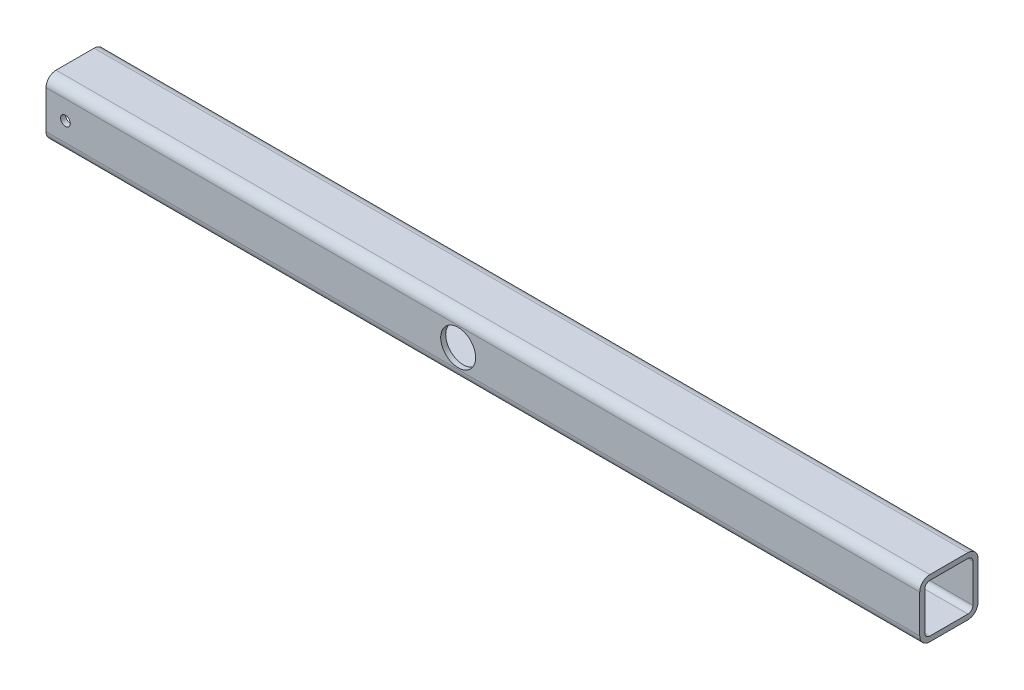
ISO-10303-21;
HEADER;
FILE_DESCRIPTION(('STEP AP214'),'2;1');
FILE_NAME('part.step','',(''),(''),'','','');
FILE_SCHEMA(('AUTOMOTIVE_DESIGN { 1 0 10303 214 1 1 1 1 }'));
ENDSEC;
DATA;
#1=APPLICATION_CONTEXT('core data for automotive mechanical design processes');
#2=APPLICATION_PROTOCOL_DEFINITION('international standard','automotive_design',2000,#1);
#3=PRODUCT_CONTEXT('',#1,'mechanical');
#4=PRODUCT('Part','Part','',(#3));
#5=PRODUCT_RELATED_PRODUCT_CATEGORY('part','',(#4));
#6=PRODUCT_DEFINITION_FORMATION('','',#4);
#7=PRODUCT_DEFINITION_CONTEXT('part definition',#1,'design');
#8=PRODUCT_DEFINITION('design','',#6,#7);
#9=PRODUCT_DEFINITION_SHAPE('','',#8);
#10=(LENGTH_UNIT() NAMED_UNIT(*) SI_UNIT(.MILLI.,.METRE.));
#11=(NAMED_UNIT(*) PLANE_ANGLE_UNIT() SI_UNIT($,.RADIAN.));
#12=(NAMED_UNIT(*) SI_UNIT($,.STERADIAN.) SOLID_ANGLE_UNIT());
#13=UNCERTAINTY_MEASURE_WITH_UNIT(LENGTH_MEASURE(1.E-05),#10,'distance_accuracy_value','');
#14=(GEOMETRIC_REPRESENTATION_CONTEXT(3) GLOBAL_UNCERTAINTY_ASSIGNED_CONTEXT((#13)) GLOBAL_UNIT_ASSIGNED_CONTEXT((#10,
#11,#12)) REPRESENTATION_CONTEXT('',''));
#15=CARTESIAN_POINT('',(0.,0.,0.));
#16=DIRECTION('',(0.,0.,1.));
#17=DIRECTION('',(1.,0.,0.));
#18=AXIS2_PLACEMENT_3D('',#15,#16,#17);
#19=CARTESIAN_POINT('',(225.,9.8,-9.8));
#20=DIRECTION('',(-1.,0.,0.));
#21=DIRECTION('',(0.,0.,1.));
#22=AXIS2_PLACEMENT_3D('',#19,#20,#21);
#23=CYLINDRICAL_SURFACE('',#22,5.2);
#24=CARTESIAN_POINT('',(-225.,9.8,-9.8));
#25=DIRECTION('',(1.,0.,0.));
#26=DIRECTION('',(0.,0.,-1.));
#27=AXIS2_PLACEMENT_3D('',#24,#25,#26);
#28=CIRCLE('',#27,5.2);
#29=CARTESIAN_POINT('',(-225.,9.8,-15.));
#30=VERTEX_POINT('',#29);
#31=CARTESIAN_POINT('',(-225.,15.,-9.8));
#32=VERTEX_POINT('',#31);
#33=EDGE_CURVE('E253',#30,#32,#28,.T.);
#34=ORIENTED_EDGE('',*,*,#33,.T.);
#35=DIRECTION('',(-1.,0.,0.));
#36=VECTOR('',#35,1.);
#37=CARTESIAN_POINT('',(225.,15.,-9.8));
#38=LINE('',#37,#36);
#39=CARTESIAN_POINT('',(225.,15.,-9.8));
#40=VERTEX_POINT('',#39);
#41=EDGE_CURVE('E12',#40,#32,#38,.T.);
#42=ORIENTED_EDGE('',*,*,#41,.F.);
#43=CARTESIAN_POINT('',(225.,9.8,-9.8));
#44=DIRECTION('',(1.,0.,0.));
#45=DIRECTION('',(0.,0.,-1.));
#46=AXIS2_PLACEMENT_3D('',#43,#44,#45);
#47=CIRCLE('',#46,5.2);
#48=CARTESIAN_POINT('',(225.,9.8,-15.));
#49=VERTEX_POINT('',#48);
#50=EDGE_CURVE('E359',#49,#40,#47,.T.);
#51=ORIENTED_EDGE('',*,*,#50,.F.);
#52=DIRECTION('',(-1.,0.,0.));
#53=VECTOR('',#52,1.);
#54=CARTESIAN_POINT('',(225.,9.8,-15.));
#55=LINE('',#54,#53);
#56=EDGE_CURVE('E276',#49,#30,#55,.T.);
#57=ORIENTED_EDGE('',*,*,#56,.T.);
#58=EDGE_LOOP('',(#34,#42,#51,#57));
#59=FACE_BOUND('',#58,.T.);
#60=ADVANCED_FACE('F67',(#59),#23,.T.);
#61=CARTESIAN_POINT('',(225.,15.,-9.8));
#62=DIRECTION('',(0.,-1.,0.));
#63=DIRECTION('',(0.,0.,-1.));
#64=AXIS2_PLACEMENT_3D('',#61,#62,#63);
#65=PLANE('',#64);
#66=DIRECTION('',(0.,0.,1.));
#67=VECTOR('',#66,1.);
#68=CARTESIAN_POINT('',(-225.,15.,-9.8));
#69=LINE('',#68,#67);
#70=CARTESIAN_POINT('',(-225.,15.,9.8));
#71=VERTEX_POINT('',#70);
#72=EDGE_CURVE('E257',#32,#71,#69,.T.);
#73=ORIENTED_EDGE('',*,*,#72,.T.);
#74=DIRECTION('',(-1.,0.,0.));
#75=VECTOR('',#74,1.);
#76=CARTESIAN_POINT('',(225.,15.,9.8));
#77=LINE('',#76,#75);
#78=CARTESIAN_POINT('',(225.,15.,9.8));
#79=VERTEX_POINT('',#78);
#80=EDGE_CURVE('E78',#79,#71,#77,.T.);
#81=ORIENTED_EDGE('',*,*,#80,.F.);
#82=DIRECTION('',(0.,0.,1.));
#83=VECTOR('',#82,1.);
#84=CARTESIAN_POINT('',(225.,15.,-9.8));
#85=LINE('',#84,#83);
#86=EDGE_CURVE('E362',#40,#79,#85,.T.);
#87=ORIENTED_EDGE('',*,*,#86,.F.);
#88=ORIENTED_EDGE('',*,*,#41,.T.);
#89=EDGE_LOOP('',(#73,#81,#87,#88));
#90=FACE_BOUND('',#89,.T.);
#91=ADVANCED_FACE('F404',(#90),#65,.F.);
#92=CARTESIAN_POINT('',(225.,9.8,9.8));
#93=DIRECTION('',(-1.,0.,0.));
#94=DIRECTION('',(0.,0.,1.));
#95=AXIS2_PLACEMENT_3D('',#92,#93,#94);
#96=CYLINDRICAL_SURFACE('',#95,5.2);
#97=CARTESIAN_POINT('',(-225.,9.8,9.8));
#98=DIRECTION('',(1.,0.,0.));
#99=DIRECTION('',(0.,0.,-1.));
#100=AXIS2_PLACEMENT_3D('',#97,#98,#99);
#101=CIRCLE('',#100,5.2);
#102=CARTESIAN_POINT('',(-225.,9.8,15.));
#103=VERTEX_POINT('',#102);
#104=EDGE_CURVE('E260',#71,#103,#101,.T.);
#105=ORIENTED_EDGE('',*,*,#104,.T.);
#106=DIRECTION('',(-1.,0.,0.));
#107=VECTOR('',#106,1.);
#108=CARTESIAN_POINT('',(225.,9.8,15.));
#109=LINE('',#108,#107);
#110=CARTESIAN_POINT('',(225.,9.8,15.));
#111=VERTEX_POINT('',#110);
#112=EDGE_CURVE('E287',#111,#103,#109,.T.);
#113=ORIENTED_EDGE('',*,*,#112,.F.);
#114=CARTESIAN_POINT('',(225.,9.8,9.8));
#115=DIRECTION('',(1.,0.,0.));
#116=DIRECTION('',(0.,0.,-1.));
#117=AXIS2_PLACEMENT_3D('',#114,#115,#116);
#118=CIRCLE('',#117,5.2);
#119=EDGE_CURVE('E365',#79,#111,#118,.T.);
#120=ORIENTED_EDGE('',*,*,#119,.F.);
#121=ORIENTED_EDGE('',*,*,#80,.T.);
#122=EDGE_LOOP('',(#105,#113,#120,#121));
#123=FACE_BOUND('',#122,.T.);
#124=ADVANCED_FACE('F409',(#123),#96,.T.);
#125=CARTESIAN_POINT('',(225.,-9.8,15.));
#126=DIRECTION('',(0.,0.,-1.));
#127=DIRECTION('',(-1.,0.,0.));
#128=AXIS2_PLACEMENT_3D('',#125,#126,#127);
#129=PLANE('',#128);
#130=CARTESIAN_POINT('',(-215.,0.,15.));
#131=DIRECTION('',(0.,0.,1.));
#132=DIRECTION('',(1.,0.,0.));
#133=AXIS2_PLACEMENT_3D('',#130,#131,#132);
#134=CIRCLE('',#133,2.5);
#135=CARTESIAN_POINT('',(-212.5,0.,15.));
#136=VERTEX_POINT('',#135);
#137=EDGE_CURVE('E575',#136,#136,#134,.T.);
#138=ORIENTED_EDGE('',*,*,#137,.F.);
#139=EDGE_LOOP('',(#138));
#140=FACE_BOUND('',#139,.T.);
#141=CARTESIAN_POINT('',(-12.73,0.,15.));
#142=DIRECTION('',(0.,0.,1.));
#143=DIRECTION('',(1.,0.,0.));
#144=AXIS2_PLACEMENT_3D('',#141,#142,#143);
#145=CIRCLE('',#144,9.);
#146=CARTESIAN_POINT('',(-3.72999999999999,0.,15.));
#147=VERTEX_POINT('',#146);
#148=EDGE_CURVE('E585',#147,#147,#145,.T.);
#149=ORIENTED_EDGE('',*,*,#148,.F.);
#150=EDGE_LOOP('',(#149));
#151=FACE_BOUND('',#150,.T.);
#152=DIRECTION('',(0.,-1.,0.));
#153=VECTOR('',#152,1.);
#154=CARTESIAN_POINT('',(-225.,-9.8,15.));
#155=LINE('',#154,#153);
#156=CARTESIAN_POINT('',(-225.,-9.8,15.));
#157=VERTEX_POINT('',#156);
#158=EDGE_CURVE('E263',#103,#157,#155,.T.);
#159=ORIENTED_EDGE('',*,*,#158,.T.);
#160=DIRECTION('',(-1.,0.,0.));
#161=VECTOR('',#160,1.);
#162=CARTESIAN_POINT('',(225.,-9.8,15.));
#163=LINE('',#162,#161);
#164=CARTESIAN_POINT('',(225.,-9.8,15.));
#165=VERTEX_POINT('',#164);
#166=EDGE_CURVE('E283',#165,#157,#163,.T.);
#167=ORIENTED_EDGE('',*,*,#166,.F.);
#168=DIRECTION('',(0.,-1.,0.));
#169=VECTOR('',#168,1.);
#170=CARTESIAN_POINT('',(225.,-9.8,15.));
#171=LINE('',#170,#169);
#172=EDGE_CURVE('E368',#111,#165,#171,.T.);
#173=ORIENTED_EDGE('',*,*,#172,.F.);
#174=ORIENTED_EDGE('',*,*,#112,.T.);
#175=EDGE_LOOP('',(#159,#167,#173,#174));
#176=FACE_BOUND('',#175,.T.);
#177=ADVANCED_FACE('F376',(#140,#151,#176),#129,.F.);
#178=CARTESIAN_POINT('',(225.,-9.8,9.8));
#179=DIRECTION('',(-1.,0.,0.));
#180=DIRECTION('',(0.,0.,1.));
#181=AXIS2_PLACEMENT_3D('',#178,#179,#180);
#182=CYLINDRICAL_SURFACE('',#181,5.2);
#183=CARTESIAN_POINT('',(-225.,-9.8,9.8));
#184=DIRECTION('',(1.,0.,0.));
#185=DIRECTION('',(0.,0.,-1.));
#186=AXIS2_PLACEMENT_3D('',#183,#184,#185);
#187=CIRCLE('',#186,5.2);
#188=CARTESIAN_POINT('',(-225.,-15.,9.8));
#189=VERTEX_POINT('',#188);
#190=EDGE_CURVE('E266',#157,#189,#187,.T.);
#191=ORIENTED_EDGE('',*,*,#190,.T.);
#192=DIRECTION('',(-1.,0.,0.));
#193=VECTOR('',#192,1.);
#194=CARTESIAN_POINT('',(225.,-15.,9.8));
#195=LINE('',#194,#193);
#196=CARTESIAN_POINT('',(225.,-15.,9.8));
#197=VERTEX_POINT('',#196);
#198=EDGE_CURVE('E209',#197,#189,#195,.T.);
#199=ORIENTED_EDGE('',*,*,#198,.F.);
#200=CARTESIAN_POINT('',(225.,-9.8,9.8));
#201=DIRECTION('',(1.,0.,0.));
#202=DIRECTION('',(0.,0.,-1.));
#203=AXIS2_PLACEMENT_3D('',#200,#201,#202);
#204=CIRCLE('',#203,5.2);
#205=EDGE_CURVE('E198',#165,#197,#204,.T.);
#206=ORIENTED_EDGE('',*,*,#205,.F.);
#207=ORIENTED_EDGE('',*,*,#166,.T.);
#208=EDGE_LOOP('',(#191,#199,#206,#207));
#209=FACE_BOUND('',#208,.T.);
#210=ADVANCED_FACE('F380',(#209),#182,.T.);
#211=CARTESIAN_POINT('',(225.,-15.,9.8));
#212=DIRECTION('',(0.,1.,0.));
#213=DIRECTION('',(0.,0.,1.));
#214=AXIS2_PLACEMENT_3D('',#211,#212,#213);
#215=PLANE('',#214);
#216=DIRECTION('',(0.,0.,-1.));
#217=VECTOR('',#216,1.);
#218=CARTESIAN_POINT('',(-225.,-15.,9.8));
#219=LINE('',#218,#217);
#220=CARTESIAN_POINT('',(-225.,-15.,-9.8));
#221=VERTEX_POINT('',#220);
#222=EDGE_CURVE('E207',#189,#221,#219,.T.);
#223=ORIENTED_EDGE('',*,*,#222,.T.);
#224=DIRECTION('',(-1.,0.,0.));
#225=VECTOR('',#224,1.);
#226=CARTESIAN_POINT('',(225.,-15.,-9.8));
#227=LINE('',#226,#225);
#228=CARTESIAN_POINT('',(225.,-15.,-9.8));
#229=VERTEX_POINT('',#228);
#230=EDGE_CURVE('E204',#229,#221,#227,.T.);
#231=ORIENTED_EDGE('',*,*,#230,.F.);
#232=DIRECTION('',(0.,0.,-1.));
#233=VECTOR('',#232,1.);
#234=CARTESIAN_POINT('',(225.,-15.,9.8));
#235=LINE('',#234,#233);
#236=EDGE_CURVE('E192',#197,#229,#235,.T.);
#237=ORIENTED_EDGE('',*,*,#236,.F.);
#238=ORIENTED_EDGE('',*,*,#198,.T.);
#239=EDGE_LOOP('',(#223,#231,#237,#238));
#240=FACE_BOUND('',#239,.T.);
#241=ADVANCED_FACE('F205',(#240),#215,.F.);
#242=CARTESIAN_POINT('',(225.,-9.8,-9.8));
#243=DIRECTION('',(-1.,0.,0.));
#244=DIRECTION('',(0.,0.,1.));
#245=AXIS2_PLACEMENT_3D('',#242,#243,#244);
#246=CYLINDRICAL_SURFACE('',#245,5.2);
#247=CARTESIAN_POINT('',(-225.,-9.8,-9.8));
#248=DIRECTION('',(1.,0.,0.));
#249=DIRECTION('',(0.,0.,-1.));
#250=AXIS2_PLACEMENT_3D('',#247,#248,#249);
#251=CIRCLE('',#250,5.2);
#252=CARTESIAN_POINT('',(-225.,-9.8,-15.));
#253=VERTEX_POINT('',#252);
#254=EDGE_CURVE('E140',#221,#253,#251,.T.);
#255=ORIENTED_EDGE('',*,*,#254,.T.);
#256=DIRECTION('',(-1.,0.,0.));
#257=VECTOR('',#256,1.);
#258=CARTESIAN_POINT('',(225.,-9.8,-15.));
#259=LINE('',#258,#257);
#260=CARTESIAN_POINT('',(225.,-9.8,-15.));
#261=VERTEX_POINT('',#260);
#262=EDGE_CURVE('E210',#261,#253,#259,.T.);
#263=ORIENTED_EDGE('',*,*,#262,.F.);
#264=CARTESIAN_POINT('',(225.,-9.8,-9.8));
#265=DIRECTION('',(1.,0.,0.));
#266=DIRECTION('',(0.,0.,-1.));
#267=AXIS2_PLACEMENT_3D('',#264,#265,#266);
#268=CIRCLE('',#267,5.2);
#269=EDGE_CURVE('E196',#229,#261,#268,.T.);
#270=ORIENTED_EDGE('',*,*,#269,.F.);
#271=ORIENTED_EDGE('',*,*,#230,.T.);
#272=EDGE_LOOP('',(#255,#263,#270,#271));
#273=FACE_BOUND('',#272,.T.);
#274=ADVANCED_FACE('F212',(#273),#246,.T.);
#275=CARTESIAN_POINT('',(225.,9.8,9.8));
#276=DIRECTION('',(-1.,0.,0.));
#277=DIRECTION('',(0.,0.,1.));
#278=AXIS2_PLACEMENT_3D('',#275,#276,#277);
#279=CYLINDRICAL_SURFACE('',#278,2.6);
#280=CARTESIAN_POINT('',(-225.,9.8,9.8));
#281=DIRECTION('',(1.,0.,0.));
#282=DIRECTION('',(0.,0.,-1.));
#283=AXIS2_PLACEMENT_3D('',#280,#281,#282);
#284=CIRCLE('',#283,2.6);
#285=CARTESIAN_POINT('',(-225.,12.4,9.8));
#286=VERTEX_POINT('',#285);
#287=CARTESIAN_POINT('',(-225.,9.8,12.4));
#288=VERTEX_POINT('',#287);
#289=EDGE_CURVE('E220',#286,#288,#284,.T.);
#290=ORIENTED_EDGE('',*,*,#289,.F.);
#291=DIRECTION('',(-1.,0.,0.));
#292=VECTOR('',#291,1.);
#293=CARTESIAN_POINT('',(225.,12.4,9.8));
#294=LINE('',#293,#292);
#295=CARTESIAN_POINT('',(225.,12.4,9.8));
#296=VERTEX_POINT('',#295);
#297=EDGE_CURVE('E71',#296,#286,#294,.T.);
#298=ORIENTED_EDGE('',*,*,#297,.F.);
#299=CARTESIAN_POINT('',(225.,9.8,9.8));
#300=DIRECTION('',(1.,0.,0.));
#301=DIRECTION('',(0.,0.,-1.));
#302=AXIS2_PLACEMENT_3D('',#299,#300,#301);
#303=CIRCLE('',#302,2.6);
#304=CARTESIAN_POINT('',(225.,9.8,12.4));
#305=VERTEX_POINT('',#304);
#306=EDGE_CURVE('E275',#296,#305,#303,.T.);
#307=ORIENTED_EDGE('',*,*,#306,.T.);
#308=DIRECTION('',(-1.,0.,0.));
#309=VECTOR('',#308,1.);
#310=CARTESIAN_POINT('',(225.,9.8,12.4));
#311=LINE('',#310,#309);
#312=EDGE_CURVE('E216',#305,#288,#311,.T.);
#313=ORIENTED_EDGE('',*,*,#312,.T.);
#314=EDGE_LOOP('',(#290,#298,#307,#313));
#315=FACE_BOUND('',#314,.T.);
#316=ADVANCED_FACE('F69',(#315),#279,.F.);
#317=CARTESIAN_POINT('',(225.,12.4,-9.8));
#318=DIRECTION('',(0.,-1.,0.));
#319=DIRECTION('',(0.,0.,-1.));
#320=AXIS2_PLACEMENT_3D('',#317,#318,#319);
#321=PLANE('',#320);
#322=DIRECTION('',(0.,0.,1.));
#323=VECTOR('',#322,1.);
#324=CARTESIAN_POINT('',(-225.,12.4,-9.8));
#325=LINE('',#324,#323);
#326=CARTESIAN_POINT('',(-225.,12.4,-9.8));
#327=VERTEX_POINT('',#326);
#328=EDGE_CURVE('E224',#327,#286,#325,.T.);
#329=ORIENTED_EDGE('',*,*,#328,.F.);
#330=DIRECTION('',(-1.,0.,0.));
#331=VECTOR('',#330,1.);
#332=CARTESIAN_POINT('',(225.,12.4,-9.8));
#333=LINE('',#332,#331);
#334=CARTESIAN_POINT('',(225.,12.4,-9.8));
#335=VERTEX_POINT('',#334);
#336=EDGE_CURVE('E310',#335,#327,#333,.T.);
#337=ORIENTED_EDGE('',*,*,#336,.F.);
#338=DIRECTION('',(0.,0.,1.));
#339=VECTOR('',#338,1.);
#340=CARTESIAN_POINT('',(225.,12.4,-9.8));
#341=LINE('',#340,#339);
#342=EDGE_CURVE('E321',#335,#296,#341,.T.);
#343=ORIENTED_EDGE('',*,*,#342,.T.);
#344=ORIENTED_EDGE('',*,*,#297,.T.);
#345=EDGE_LOOP('',(#329,#337,#343,#344));
#346=FACE_BOUND('',#345,.T.);
#347=ADVANCED_FACE('F319',(#346),#321,.T.);
#348=CARTESIAN_POINT('',(225.,9.8,-9.8));
#349=DIRECTION('',(-1.,0.,0.));
#350=DIRECTION('',(0.,0.,1.));
#351=AXIS2_PLACEMENT_3D('',#348,#349,#350);
#352=CYLINDRICAL_SURFACE('',#351,2.6);
#353=CARTESIAN_POINT('',(-225.,9.8,-9.8));
#354=DIRECTION('',(1.,0.,0.));
#355=DIRECTION('',(0.,0.,-1.));
#356=AXIS2_PLACEMENT_3D('',#353,#354,#355);
#357=CIRCLE('',#356,2.6);
#358=CARTESIAN_POINT('',(-225.,9.8,-12.4));
#359=VERTEX_POINT('',#358);
#360=EDGE_CURVE('E229',#359,#327,#357,.T.);
#361=ORIENTED_EDGE('',*,*,#360,.F.);
#362=DIRECTION('',(-1.,0.,0.));
#363=VECTOR('',#362,1.);
#364=CARTESIAN_POINT('',(225.,9.8,-12.4));
#365=LINE('',#364,#363);
#366=CARTESIAN_POINT('',(225.,9.8,-12.4));
#367=VERTEX_POINT('',#366);
#368=EDGE_CURVE('E308',#367,#359,#365,.T.);
#369=ORIENTED_EDGE('',*,*,#368,.F.);
#370=CARTESIAN_POINT('',(225.,9.8,-9.8));
#371=DIRECTION('',(1.,0.,0.));
#372=DIRECTION('',(0.,0.,-1.));
#373=AXIS2_PLACEMENT_3D('',#370,#371,#372);
#374=CIRCLE('',#373,2.6);
#375=EDGE_CURVE('E329',#367,#335,#374,.T.);
#376=ORIENTED_EDGE('',*,*,#375,.T.);
#377=ORIENTED_EDGE('',*,*,#336,.T.);
#378=EDGE_LOOP('',(#361,#369,#376,#377));
#379=FACE_BOUND('',#378,.T.);
#380=ADVANCED_FACE('F327',(#379),#352,.F.);
#381=CARTESIAN_POINT('',(225.,9.8,-12.4));
#382=DIRECTION('',(0.,0.,1.));
#383=DIRECTION('',(1.,0.,0.));
#384=AXIS2_PLACEMENT_3D('',#381,#382,#383);
#385=PLANE('',#384);
#386=CARTESIAN_POINT('',(-215.,0.,-12.4));
#387=DIRECTION('',(0.,0.,1.));
#388=DIRECTION('',(1.,0.,0.));
#389=AXIS2_PLACEMENT_3D('',#386,#387,#388);
#390=CIRCLE('',#389,2.5);
#391=CARTESIAN_POINT('',(-212.5,0.,-12.4));
#392=VERTEX_POINT('',#391);
#393=EDGE_CURVE('E225',#392,#392,#390,.T.);
#394=ORIENTED_EDGE('',*,*,#393,.F.);
#395=EDGE_LOOP('',(#394));
#396=FACE_BOUND('',#395,.T.);
#397=CARTESIAN_POINT('',(-12.73,0.,-12.4));
#398=DIRECTION('',(0.,0.,1.));
#399=DIRECTION('',(1.,0.,0.));
#400=AXIS2_PLACEMENT_3D('',#397,#398,#399);
#401=CIRCLE('',#400,9.);
#402=CARTESIAN_POINT('',(-3.72999999999999,0.,-12.4));
#403=VERTEX_POINT('',#402);
#404=EDGE_CURVE('E594',#403,#403,#401,.T.);
#405=ORIENTED_EDGE('',*,*,#404,.F.);
#406=EDGE_LOOP('',(#405));
#407=FACE_BOUND('',#406,.T.);
#408=DIRECTION('',(0.,1.,0.));
#409=VECTOR('',#408,1.);
#410=CARTESIAN_POINT('',(-225.,9.8,-12.4));
#411=LINE('',#410,#409);
#412=CARTESIAN_POINT('',(-225.,-9.8,-12.4));
#413=VERTEX_POINT('',#412);
#414=EDGE_CURVE('E233',#413,#359,#411,.T.);
#415=ORIENTED_EDGE('',*,*,#414,.F.);
#416=DIRECTION('',(-1.,0.,0.));
#417=VECTOR('',#416,1.);
#418=CARTESIAN_POINT('',(225.,-9.8,-12.4));
#419=LINE('',#418,#417);
#420=CARTESIAN_POINT('',(225.,-9.8,-12.4));
#421=VERTEX_POINT('',#420);
#422=EDGE_CURVE('E305',#421,#413,#419,.T.);
#423=ORIENTED_EDGE('',*,*,#422,.F.);
#424=DIRECTION('',(0.,1.,0.));
#425=VECTOR('',#424,1.);
#426=CARTESIAN_POINT('',(225.,9.8,-12.4));
#427=LINE('',#426,#425);
#428=EDGE_CURVE('E335',#421,#367,#427,.T.);
#429=ORIENTED_EDGE('',*,*,#428,.T.);
#430=ORIENTED_EDGE('',*,*,#368,.T.);
#431=EDGE_LOOP('',(#415,#423,#429,#430));
#432=FACE_BOUND('',#431,.T.);
#433=ADVANCED_FACE('F339',(#396,#407,#432),#385,.T.);
#434=CARTESIAN_POINT('',(225.,-9.8,-9.8));
#435=DIRECTION('',(-1.,0.,0.));
#436=DIRECTION('',(0.,0.,1.));
#437=AXIS2_PLACEMENT_3D('',#434,#435,#436);
#438=CYLINDRICAL_SURFACE('',#437,2.6);
#439=CARTESIAN_POINT('',(-225.,-9.8,-9.8));
#440=DIRECTION('',(1.,0.,0.));
#441=DIRECTION('',(0.,0.,-1.));
#442=AXIS2_PLACEMENT_3D('',#439,#440,#441);
#443=CIRCLE('',#442,2.6);
#444=CARTESIAN_POINT('',(-225.,-12.4,-9.8));
#445=VERTEX_POINT('',#444);
#446=EDGE_CURVE('E237',#445,#413,#443,.T.);
#447=ORIENTED_EDGE('',*,*,#446,.F.);
#448=DIRECTION('',(-1.,0.,0.));
#449=VECTOR('',#448,1.);
#450=CARTESIAN_POINT('',(225.,-12.4,-9.8));
#451=LINE('',#450,#449);
#452=CARTESIAN_POINT('',(225.,-12.4,-9.8));
#453=VERTEX_POINT('',#452);
#454=EDGE_CURVE('E302',#453,#445,#451,.T.);
#455=ORIENTED_EDGE('',*,*,#454,.F.);
#456=CARTESIAN_POINT('',(225.,-9.8,-9.8));
#457=DIRECTION('',(1.,0.,0.));
#458=DIRECTION('',(0.,0.,-1.));
#459=AXIS2_PLACEMENT_3D('',#456,#457,#458);
#460=CIRCLE('',#459,2.6);
#461=EDGE_CURVE('E341',#453,#421,#460,.T.);
#462=ORIENTED_EDGE('',*,*,#461,.T.);
#463=ORIENTED_EDGE('',*,*,#422,.T.);
#464=EDGE_LOOP('',(#447,#455,#462,#463));
#465=FACE_BOUND('',#464,.T.);
#466=ADVANCED_FACE('F420',(#465),#438,.F.);
#467=CARTESIAN_POINT('',(225.,-12.4,9.8));
#468=DIRECTION('',(0.,1.,0.));
#469=DIRECTION('',(0.,0.,1.));
#470=AXIS2_PLACEMENT_3D('',#467,#468,#469);
#471=PLANE('',#470);
#472=DIRECTION('',(0.,0.,-1.));
#473=VECTOR('',#472,1.);
#474=CARTESIAN_POINT('',(-225.,-12.4,9.8));
#475=LINE('',#474,#473);
#476=CARTESIAN_POINT('',(-225.,-12.4,9.8));
#477=VERTEX_POINT('',#476);
#478=EDGE_CURVE('E241',#477,#445,#475,.T.);
#479=ORIENTED_EDGE('',*,*,#478,.F.);
#480=DIRECTION('',(-1.,0.,0.));
#481=VECTOR('',#480,1.);
#482=CARTESIAN_POINT('',(225.,-12.4,9.8));
#483=LINE('',#482,#481);
#484=CARTESIAN_POINT('',(225.,-12.4,9.8));
#485=VERTEX_POINT('',#484);
#486=EDGE_CURVE('E299',#485,#477,#483,.T.);
#487=ORIENTED_EDGE('',*,*,#486,.F.);
#488=DIRECTION('',(0.,0.,-1.));
#489=VECTOR('',#488,1.);
#490=CARTESIAN_POINT('',(225.,-12.4,9.8));
#491=LINE('',#490,#489);
#492=EDGE_CURVE('E344',#485,#453,#491,.T.);
#493=ORIENTED_EDGE('',*,*,#492,.T.);
#494=ORIENTED_EDGE('',*,*,#454,.T.);
#495=EDGE_LOOP('',(#479,#487,#493,#494));
#496=FACE_BOUND('',#495,.T.);
#497=ADVANCED_FACE('F416',(#496),#471,.T.);
#498=CARTESIAN_POINT('',(225.,-9.8,9.8));
#499=DIRECTION('',(-1.,0.,0.));
#500=DIRECTION('',(0.,0.,1.));
#501=AXIS2_PLACEMENT_3D('',#498,#499,#500);
#502=CYLINDRICAL_SURFACE('',#501,2.6);
#503=CARTESIAN_POINT('',(-225.,-9.8,9.8));
#504=DIRECTION('',(1.,0.,0.));
#505=DIRECTION('',(0.,0.,-1.));
#506=AXIS2_PLACEMENT_3D('',#503,#504,#505);
#507=CIRCLE('',#506,2.6);
#508=CARTESIAN_POINT('',(-225.,-9.8,12.4));
#509=VERTEX_POINT('',#508);
#510=EDGE_CURVE('E245',#509,#477,#507,.T.);
#511=ORIENTED_EDGE('',*,*,#510,.F.);
#512=DIRECTION('',(-1.,0.,0.));
#513=VECTOR('',#512,1.);
#514=CARTESIAN_POINT('',(225.,-9.8,12.4));
#515=LINE('',#514,#513);
#516=CARTESIAN_POINT('',(225.,-9.8,12.4));
#517=VERTEX_POINT('',#516);
#518=EDGE_CURVE('E296',#517,#509,#515,.T.);
#519=ORIENTED_EDGE('',*,*,#518,.F.);
#520=CARTESIAN_POINT('',(225.,-9.8,9.8));
#521=DIRECTION('',(1.,0.,0.));
#522=DIRECTION('',(0.,0.,-1.));
#523=AXIS2_PLACEMENT_3D('',#520,#521,#522);
#524=CIRCLE('',#523,2.6);
#525=EDGE_CURVE('E351',#517,#485,#524,.T.);
#526=ORIENTED_EDGE('',*,*,#525,.T.);
#527=ORIENTED_EDGE('',*,*,#486,.T.);
#528=EDGE_LOOP('',(#511,#519,#526,#527));
#529=FACE_BOUND('',#528,.T.);
#530=ADVANCED_FACE('F396',(#529),#502,.F.);
#531=CARTESIAN_POINT('',(225.,-9.8,12.4));
#532=DIRECTION('',(0.,0.,-1.));
#533=DIRECTION('',(-1.,0.,0.));
#534=AXIS2_PLACEMENT_3D('',#531,#532,#533);
#535=PLANE('',#534);
#536=CARTESIAN_POINT('',(-215.,0.,12.4));
#537=DIRECTION('',(0.,0.,-1.));
#538=DIRECTION('',(-1.,0.,0.));
#539=AXIS2_PLACEMENT_3D('',#536,#537,#538);
#540=CIRCLE('',#539,2.5);
#541=CARTESIAN_POINT('',(-217.5,0.,12.4));
#542=VERTEX_POINT('',#541);
#543=EDGE_CURVE('E572',#542,#542,#540,.T.);
#544=ORIENTED_EDGE('',*,*,#543,.F.);
#545=EDGE_LOOP('',(#544));
#546=FACE_BOUND('',#545,.T.);
#547=CARTESIAN_POINT('',(-12.73,0.,12.4));
#548=DIRECTION('',(0.,0.,-1.));
#549=DIRECTION('',(-1.,0.,0.));
#550=AXIS2_PLACEMENT_3D('',#547,#548,#549);
#551=CIRCLE('',#550,9.);
#552=CARTESIAN_POINT('',(-21.73,0.,12.4));
#553=VERTEX_POINT('',#552);
#554=EDGE_CURVE('E582',#553,#553,#551,.T.);
#555=ORIENTED_EDGE('',*,*,#554,.F.);
#556=EDGE_LOOP('',(#555));
#557=FACE_BOUND('',#556,.T.);
#558=DIRECTION('',(0.,-1.,0.));
#559=VECTOR('',#558,1.);
#560=CARTESIAN_POINT('',(-225.,-9.8,12.4));
#561=LINE('',#560,#559);
#562=EDGE_CURVE('E249',#288,#509,#561,.T.);
#563=ORIENTED_EDGE('',*,*,#562,.F.);
#564=ORIENTED_EDGE('',*,*,#312,.F.);
#565=DIRECTION('',(0.,-1.,0.));
#566=VECTOR('',#565,1.);
#567=CARTESIAN_POINT('',(225.,-9.8,12.4));
#568=LINE('',#567,#566);
#569=EDGE_CURVE('E355',#305,#517,#568,.T.);
#570=ORIENTED_EDGE('',*,*,#569,.T.);
#571=ORIENTED_EDGE('',*,*,#518,.T.);
#572=EDGE_LOOP('',(#563,#564,#570,#571));
#573=FACE_BOUND('',#572,.T.);
#574=ADVANCED_FACE('F388',(#546,#557,#573),#535,.T.);
#575=CARTESIAN_POINT('',(225.,9.8,-15.));
#576=DIRECTION('',(0.,0.,1.));
#577=DIRECTION('',(1.,0.,0.));
#578=AXIS2_PLACEMENT_3D('',#575,#576,#577);
#579=PLANE('',#578);
#580=CARTESIAN_POINT('',(-215.,0.,-15.));
#581=DIRECTION('',(0.,0.,1.));
#582=DIRECTION('',(1.,0.,0.));
#583=AXIS2_PLACEMENT_3D('',#580,#581,#582);
#584=CIRCLE('',#583,2.5);
#585=CARTESIAN_POINT('',(-212.5,0.,-15.));
#586=VERTEX_POINT('',#585);
#587=EDGE_CURVE('E577',#586,#586,#584,.T.);
#588=ORIENTED_EDGE('',*,*,#587,.T.);
#589=EDGE_LOOP('',(#588));
#590=FACE_BOUND('',#589,.T.);
#591=CARTESIAN_POINT('',(-12.73,0.,-15.));
#592=DIRECTION('',(0.,0.,1.));
#593=DIRECTION('',(1.,0.,0.));
#594=AXIS2_PLACEMENT_3D('',#591,#592,#593);
#595=CIRCLE('',#594,9.);
#596=CARTESIAN_POINT('',(-3.72999999999999,0.,-15.));
#597=VERTEX_POINT('',#596);
#598=EDGE_CURVE('E578',#597,#597,#595,.T.);
#599=ORIENTED_EDGE('',*,*,#598,.T.);
#600=EDGE_LOOP('',(#599));
#601=FACE_BOUND('',#600,.T.);
#602=DIRECTION('',(0.,1.,0.));
#603=VECTOR('',#602,1.);
#604=CARTESIAN_POINT('',(-225.,9.8,-15.));
#605=LINE('',#604,#603);
#606=EDGE_CURVE('E146',#253,#30,#605,.T.);
#607=ORIENTED_EDGE('',*,*,#606,.T.);
#608=ORIENTED_EDGE('',*,*,#56,.F.);
#609=DIRECTION('',(0.,1.,0.));
#610=VECTOR('',#609,1.);
#611=CARTESIAN_POINT('',(225.,9.8,-15.));
#612=LINE('',#611,#610);
#613=EDGE_CURVE('E87',#261,#49,#612,.T.);
#614=ORIENTED_EDGE('',*,*,#613,.F.);
#615=ORIENTED_EDGE('',*,*,#262,.T.);
#616=EDGE_LOOP('',(#607,#608,#614,#615));
#617=FACE_BOUND('',#616,.T.);
#618=ADVANCED_FACE('F386',(#590,#601,#617),#579,.F.);
#619=CARTESIAN_POINT('',(225.,9.8,-9.8));
#620=DIRECTION('',(1.,0.,0.));
#621=DIRECTION('',(0.,0.,-1.));
#622=AXIS2_PLACEMENT_3D('',#619,#620,#621);
#623=PLANE('',#622);
#624=ORIENTED_EDGE('',*,*,#306,.F.);
#625=ORIENTED_EDGE('',*,*,#342,.F.);
#626=ORIENTED_EDGE('',*,*,#375,.F.);
#627=ORIENTED_EDGE('',*,*,#428,.F.);
#628=ORIENTED_EDGE('',*,*,#461,.F.);
#629=ORIENTED_EDGE('',*,*,#492,.F.);
#630=ORIENTED_EDGE('',*,*,#525,.F.);
#631=ORIENTED_EDGE('',*,*,#569,.F.);
#632=EDGE_LOOP('',(#624,#625,#626,#627,#628,#629,#630,#631));
#633=FACE_BOUND('',#632,.T.);
#634=ORIENTED_EDGE('',*,*,#50,.T.);
#635=ORIENTED_EDGE('',*,*,#86,.T.);
#636=ORIENTED_EDGE('',*,*,#119,.T.);
#637=ORIENTED_EDGE('',*,*,#172,.T.);
#638=ORIENTED_EDGE('',*,*,#205,.T.);
#639=ORIENTED_EDGE('',*,*,#236,.T.);
#640=ORIENTED_EDGE('',*,*,#269,.T.);
#641=ORIENTED_EDGE('',*,*,#613,.T.);
#642=EDGE_LOOP('',(#634,#635,#636,#637,#638,#639,#640,#641));
#643=FACE_BOUND('',#642,.T.);
#644=ADVANCED_FACE('F194',(#633,#643),#623,.T.);
#645=CARTESIAN_POINT('',(-225.,9.8,-9.8));
#646=DIRECTION('',(1.,0.,0.));
#647=DIRECTION('',(0.,0.,-1.));
#648=AXIS2_PLACEMENT_3D('',#645,#646,#647);
#649=PLANE('',#648);
#650=ORIENTED_EDGE('',*,*,#289,.T.);
#651=ORIENTED_EDGE('',*,*,#562,.T.);
#652=ORIENTED_EDGE('',*,*,#510,.T.);
#653=ORIENTED_EDGE('',*,*,#478,.T.);
#654=ORIENTED_EDGE('',*,*,#446,.T.);
#655=ORIENTED_EDGE('',*,*,#414,.T.);
#656=ORIENTED_EDGE('',*,*,#360,.T.);
#657=ORIENTED_EDGE('',*,*,#328,.T.);
#658=EDGE_LOOP('',(#650,#651,#652,#653,#654,#655,#656,#657));
#659=FACE_BOUND('',#658,.T.);
#660=ORIENTED_EDGE('',*,*,#33,.F.);
#661=ORIENTED_EDGE('',*,*,#606,.F.);
#662=ORIENTED_EDGE('',*,*,#254,.F.);
#663=ORIENTED_EDGE('',*,*,#222,.F.);
#664=ORIENTED_EDGE('',*,*,#190,.F.);
#665=ORIENTED_EDGE('',*,*,#158,.F.);
#666=ORIENTED_EDGE('',*,*,#104,.F.);
#667=ORIENTED_EDGE('',*,*,#72,.F.);
#668=EDGE_LOOP('',(#660,#661,#662,#663,#664,#665,#666,#667));
#669=FACE_BOUND('',#668,.T.);
#670=ADVANCED_FACE('F324',(#659,#669),#649,.F.);
#671=CARTESIAN_POINT('',(-12.73,0.,-15.));
#672=DIRECTION('',(0.,0.,1.));
#673=DIRECTION('',(1.,0.,0.));
#674=AXIS2_PLACEMENT_3D('',#671,#672,#673);
#675=CYLINDRICAL_SURFACE('',#674,9.);
#676=ORIENTED_EDGE('',*,*,#404,.T.);
#677=EDGE_LOOP('',(#676));
#678=FACE_BOUND('',#677,.T.);
#679=ORIENTED_EDGE('',*,*,#598,.F.);
#680=EDGE_LOOP('',(#679));
#681=FACE_BOUND('',#680,.T.);
#682=ADVANCED_FACE('F527',(#678,#681),#675,.F.);
#683=CARTESIAN_POINT('',(-215.,0.,-15.));
#684=DIRECTION('',(0.,0.,1.));
#685=DIRECTION('',(1.,0.,0.));
#686=AXIS2_PLACEMENT_3D('',#683,#684,#685);
#687=CYLINDRICAL_SURFACE('',#686,2.5);
#688=ORIENTED_EDGE('',*,*,#393,.T.);
#689=EDGE_LOOP('',(#688));
#690=FACE_BOUND('',#689,.T.);
#691=ORIENTED_EDGE('',*,*,#587,.F.);
#692=EDGE_LOOP('',(#691));
#693=FACE_BOUND('',#692,.T.);
#694=ADVANCED_FACE('F537',(#690,#693),#687,.F.);
#695=ORIENTED_EDGE('',*,*,#554,.T.);
#696=EDGE_LOOP('',(#695));
#697=FACE_BOUND('',#696,.T.);
#698=ORIENTED_EDGE('',*,*,#148,.T.);
#699=EDGE_LOOP('',(#698));
#700=FACE_BOUND('',#699,.T.);
#701=ADVANCED_FACE('F540',(#697,#700),#675,.F.);
#702=ORIENTED_EDGE('',*,*,#543,.T.);
#703=EDGE_LOOP('',(#702));
#704=FACE_BOUND('',#703,.T.);
#705=ORIENTED_EDGE('',*,*,#137,.T.);
#706=EDGE_LOOP('',(#705));
#707=FACE_BOUND('',#706,.T.);
#708=ADVANCED_FACE('F547',(#704,#707),#687,.F.);
#709=CLOSED_SHELL('',(#60,#91,#124,#177,#210,#241,#274,#316,#347,#380,#433,#466,#497,#530,#574,
#618,#644,#670,#682,#694,#701,#708));
#710=MANIFOLD_SOLID_BREP('B2',#709);
#711=ADVANCED_BREP_SHAPE_REPRESENTATION('',(#18,#710),#14);
#712=SHAPE_DEFINITION_REPRESENTATION(#9,#711);
ENDSEC;
END-ISO-10303-21;
